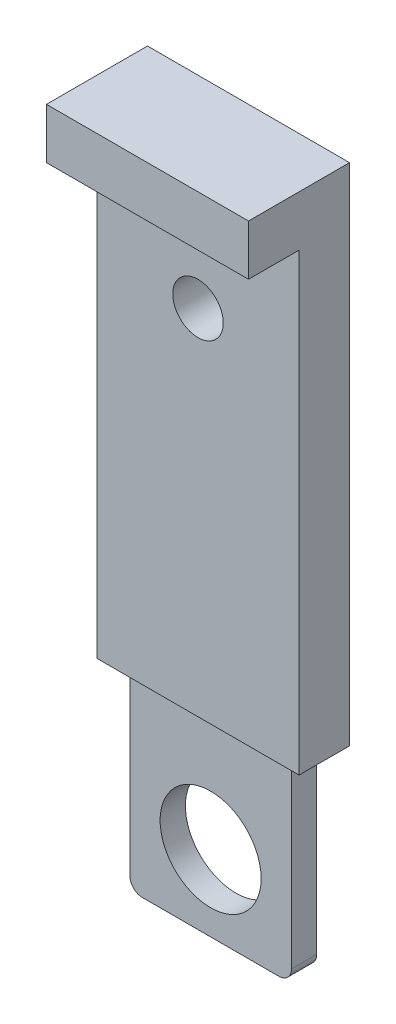
ISO-10303-21;
HEADER;
FILE_DESCRIPTION(('STEP AP214'),'2;1');
FILE_NAME('part.step','',(''),(''),'','','');
FILE_SCHEMA(('AUTOMOTIVE_DESIGN { 1 0 10303 214 1 1 1 1 }'));
ENDSEC;
DATA;
#1=APPLICATION_CONTEXT('core data for automotive mechanical design processes');
#2=APPLICATION_PROTOCOL_DEFINITION('international standard','automotive_design',2000,#1);
#3=PRODUCT_CONTEXT('',#1,'mechanical');
#4=PRODUCT('Part','Part','',(#3));
#5=PRODUCT_RELATED_PRODUCT_CATEGORY('part','',(#4));
#6=PRODUCT_DEFINITION_FORMATION('','',#4);
#7=PRODUCT_DEFINITION_CONTEXT('part definition',#1,'design');
#8=PRODUCT_DEFINITION('design','',#6,#7);
#9=PRODUCT_DEFINITION_SHAPE('','',#8);
#10=(LENGTH_UNIT() NAMED_UNIT(*) SI_UNIT(.MILLI.,.METRE.));
#11=(NAMED_UNIT(*) PLANE_ANGLE_UNIT() SI_UNIT($,.RADIAN.));
#12=(NAMED_UNIT(*) SI_UNIT($,.STERADIAN.) SOLID_ANGLE_UNIT());
#13=UNCERTAINTY_MEASURE_WITH_UNIT(LENGTH_MEASURE(1.E-05),#10,'distance_accuracy_value','');
#14=(GEOMETRIC_REPRESENTATION_CONTEXT(3) GLOBAL_UNCERTAINTY_ASSIGNED_CONTEXT((#13)) GLOBAL_UNIT_ASSIGNED_CONTEXT((#10,
#11,#12)) REPRESENTATION_CONTEXT('',''));
#15=CARTESIAN_POINT('',(0.,0.,0.));
#16=DIRECTION('',(0.,0.,1.));
#17=DIRECTION('',(1.,0.,0.));
#18=AXIS2_PLACEMENT_3D('',#15,#16,#17);
#19=CARTESIAN_POINT('',(0.,0.,0.));
#20=DIRECTION('',(0.,1.,0.));
#21=DIRECTION('',(0.,0.,1.));
#22=AXIS2_PLACEMENT_3D('',#19,#20,#21);
#23=PLANE('',#22);
#24=DIRECTION('',(1.,0.,0.));
#25=VECTOR('',#24,1.);
#26=CARTESIAN_POINT('',(-2.,0.,0.499999999999999));
#27=LINE('',#26,#25);
#28=CARTESIAN_POINT('',(1.85,0.,0.5));
#29=VERTEX_POINT('',#28);
#30=CARTESIAN_POINT('',(2.,0.,0.5));
#31=VERTEX_POINT('',#30);
#32=EDGE_CURVE('E193',#29,#31,#27,.T.);
#33=ORIENTED_EDGE('',*,*,#32,.F.);
#34=DIRECTION('',(0.,0.,1.));
#35=VECTOR('',#34,1.);
#36=CARTESIAN_POINT('',(1.85,0.,-0.25));
#37=LINE('',#36,#35);
#38=CARTESIAN_POINT('',(1.85,0.,-0.500000000000001));
#39=VERTEX_POINT('',#38);
#40=EDGE_CURVE('E219',#29,#39,#37,.F.);
#41=ORIENTED_EDGE('',*,*,#40,.T.);
#42=DIRECTION('',(1.,0.,0.));
#43=VECTOR('',#42,1.);
#44=CARTESIAN_POINT('',(-2.,0.,-0.500000000000002));
#45=LINE('',#44,#43);
#46=CARTESIAN_POINT('',(2.,0.,-0.5));
#47=VERTEX_POINT('',#46);
#48=EDGE_CURVE('E201',#39,#47,#45,.T.);
#49=ORIENTED_EDGE('',*,*,#48,.T.);
#50=DIRECTION('',(0.,0.,1.));
#51=VECTOR('',#50,1.);
#52=CARTESIAN_POINT('',(2.,0.,-0.5));
#53=LINE('',#52,#51);
#54=EDGE_CURVE('E197',#47,#31,#53,.T.);
#55=ORIENTED_EDGE('',*,*,#54,.T.);
#56=EDGE_LOOP('',(#33,#41,#49,#55));
#57=FACE_BOUND('',#56,.T.);
#58=ADVANCED_FACE('F32',(#57),#23,.F.);
#59=CARTESIAN_POINT('',(-2.,0.,-0.500000000000002));
#60=VERTEX_POINT('',#59);
#61=CARTESIAN_POINT('',(-1.85,0.,-0.500000000000002));
#62=VERTEX_POINT('',#61);
#63=EDGE_CURVE('E187',#60,#62,#45,.T.);
#64=ORIENTED_EDGE('',*,*,#63,.T.);
#65=DIRECTION('',(0.,0.,-1.));
#66=VECTOR('',#65,1.);
#67=CARTESIAN_POINT('',(-1.85,0.,0.25));
#68=LINE('',#67,#66);
#69=CARTESIAN_POINT('',(-1.85,0.,0.499999999999999));
#70=VERTEX_POINT('',#69);
#71=EDGE_CURVE('E217',#62,#70,#68,.F.);
#72=ORIENTED_EDGE('',*,*,#71,.T.);
#73=CARTESIAN_POINT('',(-2.,0.,0.499999999999999));
#74=VERTEX_POINT('',#73);
#75=EDGE_CURVE('E194',#74,#70,#27,.T.);
#76=ORIENTED_EDGE('',*,*,#75,.F.);
#77=DIRECTION('',(0.,0.,1.));
#78=VECTOR('',#77,1.);
#79=CARTESIAN_POINT('',(-2.,0.,-0.500000000000002));
#80=LINE('',#79,#78);
#81=EDGE_CURVE('E186',#60,#74,#80,.T.);
#82=ORIENTED_EDGE('',*,*,#81,.F.);
#83=EDGE_LOOP('',(#64,#72,#76,#82));
#84=FACE_BOUND('',#83,.T.);
#85=ADVANCED_FACE('F312',(#84),#23,.F.);
#86=CARTESIAN_POINT('',(-2.,10.,0.499999999999999));
#87=DIRECTION('',(0.,0.,-1.));
#88=DIRECTION('',(-1.,0.,0.));
#89=AXIS2_PLACEMENT_3D('',#86,#87,#88);
#90=PLANE('',#89);
#91=CARTESIAN_POINT('',(0.,7.,0.499999999999999));
#92=DIRECTION('',(0.,0.,-1.));
#93=DIRECTION('',(-1.,0.,0.));
#94=AXIS2_PLACEMENT_3D('',#91,#92,#93);
#95=CIRCLE('',#94,0.5);
#96=CARTESIAN_POINT('',(-0.5,7.,0.499999999999999));
#97=VERTEX_POINT('',#96);
#98=EDGE_CURVE('E183',#97,#97,#95,.T.);
#99=ORIENTED_EDGE('',*,*,#98,.T.);
#100=EDGE_LOOP('',(#99));
#101=FACE_BOUND('',#100,.T.);
#102=DIRECTION('',(1.,0.,0.));
#103=VECTOR('',#102,1.);
#104=CARTESIAN_POINT('',(2.,9.,0.5));
#105=LINE('',#104,#103);
#106=CARTESIAN_POINT('',(-2.,9.,0.499999999999999));
#107=VERTEX_POINT('',#106);
#108=CARTESIAN_POINT('',(2.,9.,0.5));
#109=VERTEX_POINT('',#108);
#110=EDGE_CURVE('E165',#107,#109,#105,.T.);
#111=ORIENTED_EDGE('',*,*,#110,.F.);
#112=DIRECTION('',(0.,-1.,0.));
#113=VECTOR('',#112,1.);
#114=CARTESIAN_POINT('',(-2.,10.,0.499999999999999));
#115=LINE('',#114,#113);
#116=EDGE_CURVE('E210',#107,#74,#115,.T.);
#117=ORIENTED_EDGE('',*,*,#116,.T.);
#118=ORIENTED_EDGE('',*,*,#75,.T.);
#119=EDGE_CURVE('E198',#70,#29,#27,.T.);
#120=ORIENTED_EDGE('',*,*,#119,.T.);
#121=ORIENTED_EDGE('',*,*,#32,.T.);
#122=DIRECTION('',(0.,-1.,0.));
#123=VECTOR('',#122,1.);
#124=CARTESIAN_POINT('',(2.,10.,0.5));
#125=LINE('',#124,#123);
#126=EDGE_CURVE('E207',#109,#31,#125,.T.);
#127=ORIENTED_EDGE('',*,*,#126,.F.);
#128=EDGE_LOOP('',(#111,#117,#118,#120,#121,#127));
#129=FACE_BOUND('',#128,.T.);
#130=ADVANCED_FACE('F318',(#101,#129),#90,.F.);
#131=CARTESIAN_POINT('',(-2.,10.,-0.500000000000002));
#132=DIRECTION('',(1.,0.,0.));
#133=DIRECTION('',(0.,0.,-1.));
#134=AXIS2_PLACEMENT_3D('',#131,#132,#133);
#135=PLANE('',#134);
#136=ORIENTED_EDGE('',*,*,#81,.T.);
#137=ORIENTED_EDGE('',*,*,#116,.F.);
#138=DIRECTION('',(0.,0.,-1.));
#139=VECTOR('',#138,1.);
#140=CARTESIAN_POINT('',(-2.,9.,1.5));
#141=LINE('',#140,#139);
#142=CARTESIAN_POINT('',(-2.,9.,1.5));
#143=VERTEX_POINT('',#142);
#144=EDGE_CURVE('E177',#143,#107,#141,.T.);
#145=ORIENTED_EDGE('',*,*,#144,.F.);
#146=DIRECTION('',(0.,-1.,0.));
#147=VECTOR('',#146,1.);
#148=CARTESIAN_POINT('',(-2.,10.,1.5));
#149=LINE('',#148,#147);
#150=CARTESIAN_POINT('',(-2.,10.,1.5));
#151=VERTEX_POINT('',#150);
#152=EDGE_CURVE('E159',#151,#143,#149,.T.);
#153=ORIENTED_EDGE('',*,*,#152,.F.);
#154=DIRECTION('',(0.,0.,1.));
#155=VECTOR('',#154,1.);
#156=CARTESIAN_POINT('',(-2.,10.,-0.500000000000002));
#157=LINE('',#156,#155);
#158=CARTESIAN_POINT('',(-2.,10.,-0.500000000000002));
#159=VERTEX_POINT('',#158);
#160=EDGE_CURVE('E151',#159,#151,#157,.T.);
#161=ORIENTED_EDGE('',*,*,#160,.F.);
#162=DIRECTION('',(0.,-1.,0.));
#163=VECTOR('',#162,1.);
#164=CARTESIAN_POINT('',(-2.,10.,-0.500000000000002));
#165=LINE('',#164,#163);
#166=EDGE_CURVE('E190',#159,#60,#165,.T.);
#167=ORIENTED_EDGE('',*,*,#166,.T.);
#168=EDGE_LOOP('',(#136,#137,#145,#153,#161,#167));
#169=FACE_BOUND('',#168,.T.);
#170=ADVANCED_FACE('F329',(#169),#135,.F.);
#171=CARTESIAN_POINT('',(2.,10.,-0.5));
#172=DIRECTION('',(1.,0.,0.));
#173=DIRECTION('',(0.,0.,-1.));
#174=AXIS2_PLACEMENT_3D('',#171,#172,#173);
#175=PLANE('',#174);
#176=ORIENTED_EDGE('',*,*,#54,.F.);
#177=DIRECTION('',(0.,-1.,0.));
#178=VECTOR('',#177,1.);
#179=CARTESIAN_POINT('',(2.,10.,-0.5));
#180=LINE('',#179,#178);
#181=CARTESIAN_POINT('',(2.,10.,-0.5));
#182=VERTEX_POINT('',#181);
#183=EDGE_CURVE('E146',#182,#47,#180,.T.);
#184=ORIENTED_EDGE('',*,*,#183,.F.);
#185=DIRECTION('',(0.,0.,1.));
#186=VECTOR('',#185,1.);
#187=CARTESIAN_POINT('',(2.,10.,-0.5));
#188=LINE('',#187,#186);
#189=CARTESIAN_POINT('',(2.,10.,1.5));
#190=VERTEX_POINT('',#189);
#191=EDGE_CURVE('E138',#182,#190,#188,.T.);
#192=ORIENTED_EDGE('',*,*,#191,.T.);
#193=DIRECTION('',(0.,1.,0.));
#194=VECTOR('',#193,1.);
#195=CARTESIAN_POINT('',(2.,10.,1.5));
#196=LINE('',#195,#194);
#197=CARTESIAN_POINT('',(2.,9.,1.5));
#198=VERTEX_POINT('',#197);
#199=EDGE_CURVE('E144',#198,#190,#196,.T.);
#200=ORIENTED_EDGE('',*,*,#199,.F.);
#201=DIRECTION('',(0.,0.,-1.));
#202=VECTOR('',#201,1.);
#203=CARTESIAN_POINT('',(2.,9.,1.5));
#204=LINE('',#203,#202);
#205=EDGE_CURVE('E174',#198,#109,#204,.T.);
#206=ORIENTED_EDGE('',*,*,#205,.T.);
#207=ORIENTED_EDGE('',*,*,#126,.T.);
#208=EDGE_LOOP('',(#176,#184,#192,#200,#206,#207));
#209=FACE_BOUND('',#208,.T.);
#210=ADVANCED_FACE('F141',(#209),#175,.T.);
#211=CARTESIAN_POINT('',(-2.,10.,-0.500000000000002));
#212=DIRECTION('',(0.,0.,-1.));
#213=DIRECTION('',(-1.,0.,0.));
#214=AXIS2_PLACEMENT_3D('',#211,#212,#213);
#215=PLANE('',#214);
#216=CARTESIAN_POINT('',(0.,7.,-0.500000000000001));
#217=DIRECTION('',(0.,0.,-1.));
#218=DIRECTION('',(-1.,0.,0.));
#219=AXIS2_PLACEMENT_3D('',#216,#217,#218);
#220=CIRCLE('',#219,0.5);
#221=CARTESIAN_POINT('',(-0.5,7.,-0.500000000000002));
#222=VERTEX_POINT('',#221);
#223=EDGE_CURVE('E180',#222,#222,#220,.T.);
#224=ORIENTED_EDGE('',*,*,#223,.F.);
#225=EDGE_LOOP('',(#224));
#226=FACE_BOUND('',#225,.T.);
#227=ORIENTED_EDGE('',*,*,#63,.F.);
#228=ORIENTED_EDGE('',*,*,#166,.F.);
#229=DIRECTION('',(1.,0.,0.));
#230=VECTOR('',#229,1.);
#231=CARTESIAN_POINT('',(-2.,10.,-0.500000000000002));
#232=LINE('',#231,#230);
#233=EDGE_CURVE('E150',#159,#182,#232,.T.);
#234=ORIENTED_EDGE('',*,*,#233,.T.);
#235=ORIENTED_EDGE('',*,*,#183,.T.);
#236=ORIENTED_EDGE('',*,*,#48,.F.);
#237=EDGE_CURVE('E204',#62,#39,#45,.T.);
#238=ORIENTED_EDGE('',*,*,#237,.F.);
#239=EDGE_LOOP('',(#227,#228,#234,#235,#236,#238));
#240=FACE_BOUND('',#239,.T.);
#241=ADVANCED_FACE('F323',(#226,#240),#215,.T.);
#242=CARTESIAN_POINT('',(0.,10.,0.));
#243=DIRECTION('',(0.,1.,0.));
#244=DIRECTION('',(0.,0.,1.));
#245=AXIS2_PLACEMENT_3D('',#242,#243,#244);
#246=PLANE('',#245);
#247=ORIENTED_EDGE('',*,*,#160,.T.);
#248=DIRECTION('',(-1.,0.,0.));
#249=VECTOR('',#248,1.);
#250=CARTESIAN_POINT('',(2.,10.,1.5));
#251=LINE('',#250,#249);
#252=EDGE_CURVE('E154',#190,#151,#251,.T.);
#253=ORIENTED_EDGE('',*,*,#252,.F.);
#254=ORIENTED_EDGE('',*,*,#191,.F.);
#255=ORIENTED_EDGE('',*,*,#233,.F.);
#256=EDGE_LOOP('',(#247,#253,#254,#255));
#257=FACE_BOUND('',#256,.T.);
#258=ADVANCED_FACE('F155',(#257),#246,.T.);
#259=CARTESIAN_POINT('',(0.,7.,9.5));
#260=DIRECTION('',(0.,0.,-1.));
#261=DIRECTION('',(-1.,0.,0.));
#262=AXIS2_PLACEMENT_3D('',#259,#260,#261);
#263=CYLINDRICAL_SURFACE('',#262,0.5);
#264=ORIENTED_EDGE('',*,*,#223,.T.);
#265=EDGE_LOOP('',(#264));
#266=FACE_BOUND('',#265,.T.);
#267=ORIENTED_EDGE('',*,*,#98,.F.);
#268=EDGE_LOOP('',(#267));
#269=FACE_BOUND('',#268,.T.);
#270=ADVANCED_FACE('F465',(#266,#269),#263,.F.);
#271=CARTESIAN_POINT('',(2.,9.,1.5));
#272=DIRECTION('',(0.,1.,0.));
#273=DIRECTION('',(0.,0.,1.));
#274=AXIS2_PLACEMENT_3D('',#271,#272,#273);
#275=PLANE('',#274);
#276=ORIENTED_EDGE('',*,*,#110,.T.);
#277=ORIENTED_EDGE('',*,*,#205,.F.);
#278=DIRECTION('',(1.,0.,0.));
#279=VECTOR('',#278,1.);
#280=CARTESIAN_POINT('',(2.,9.,1.5));
#281=LINE('',#280,#279);
#282=EDGE_CURVE('E163',#143,#198,#281,.T.);
#283=ORIENTED_EDGE('',*,*,#282,.F.);
#284=ORIENTED_EDGE('',*,*,#144,.T.);
#285=EDGE_LOOP('',(#276,#277,#283,#284));
#286=FACE_BOUND('',#285,.T.);
#287=ADVANCED_FACE('F309',(#286),#275,.F.);
#288=CARTESIAN_POINT('',(0.,0.,1.5));
#289=DIRECTION('',(0.,0.,-1.));
#290=DIRECTION('',(-1.,0.,0.));
#291=AXIS2_PLACEMENT_3D('',#288,#289,#290);
#292=PLANE('',#291);
#293=ORIENTED_EDGE('',*,*,#199,.T.);
#294=ORIENTED_EDGE('',*,*,#252,.T.);
#295=ORIENTED_EDGE('',*,*,#152,.T.);
#296=ORIENTED_EDGE('',*,*,#282,.T.);
#297=EDGE_LOOP('',(#293,#294,#295,#296));
#298=FACE_BOUND('',#297,.T.);
#299=ADVANCED_FACE('F161',(#298),#292,.F.);
#300=CARTESIAN_POINT('',(-1.6,-3.9,0.25));
#301=DIRECTION('',(1.,0.,0.));
#302=DIRECTION('',(0.,0.,-1.));
#303=AXIS2_PLACEMENT_3D('',#300,#301,#302);
#304=PLANE('',#303);
#305=DIRECTION('',(0.,1.,0.));
#306=VECTOR('',#305,1.);
#307=CARTESIAN_POINT('',(-1.6,-3.9,0.25));
#308=LINE('',#307,#306);
#309=CARTESIAN_POINT('',(-1.6,-3.65,0.25));
#310=VERTEX_POINT('',#309);
#311=CARTESIAN_POINT('',(-1.6,-0.25,0.25));
#312=VERTEX_POINT('',#311);
#313=EDGE_CURVE('E265',#310,#312,#308,.T.);
#314=ORIENTED_EDGE('',*,*,#313,.T.);
#315=DIRECTION('',(0.,0.,-1.));
#316=VECTOR('',#315,1.);
#317=CARTESIAN_POINT('',(-1.6,-0.25,-0.25));
#318=LINE('',#317,#316);
#319=CARTESIAN_POINT('',(-1.6,-0.25,-0.25));
#320=VERTEX_POINT('',#319);
#321=EDGE_CURVE('E230',#312,#320,#318,.T.);
#322=ORIENTED_EDGE('',*,*,#321,.T.);
#323=DIRECTION('',(0.,1.,0.));
#324=VECTOR('',#323,1.);
#325=CARTESIAN_POINT('',(-1.6,-3.9,-0.25));
#326=LINE('',#325,#324);
#327=CARTESIAN_POINT('',(-1.6,-3.65,-0.25));
#328=VERTEX_POINT('',#327);
#329=EDGE_CURVE('E168',#328,#320,#326,.T.);
#330=ORIENTED_EDGE('',*,*,#329,.F.);
#331=DIRECTION('',(0.,0.,-1.));
#332=VECTOR('',#331,1.);
#333=CARTESIAN_POINT('',(-1.6,-3.65,0.25));
#334=LINE('',#333,#332);
#335=EDGE_CURVE('E228',#328,#310,#334,.F.);
#336=ORIENTED_EDGE('',*,*,#335,.T.);
#337=EDGE_LOOP('',(#314,#322,#330,#336));
#338=FACE_BOUND('',#337,.T.);
#339=ADVANCED_FACE('F300',(#338),#304,.F.);
#340=CARTESIAN_POINT('',(1.6,-3.9,-0.25));
#341=DIRECTION('',(0.,0.,1.));
#342=DIRECTION('',(1.,0.,0.));
#343=AXIS2_PLACEMENT_3D('',#340,#341,#342);
#344=PLANE('',#343);
#345=CARTESIAN_POINT('',(0.,-2.4,-0.25));
#346=DIRECTION('',(0.,0.,1.));
#347=DIRECTION('',(1.,0.,0.));
#348=AXIS2_PLACEMENT_3D('',#345,#346,#347);
#349=CIRCLE('',#348,1.);
#350=CARTESIAN_POINT('',(1.,-2.4,-0.25));
#351=VERTEX_POINT('',#350);
#352=EDGE_CURVE('E253',#351,#351,#349,.T.);
#353=ORIENTED_EDGE('',*,*,#352,.T.);
#354=EDGE_LOOP('',(#353));
#355=FACE_BOUND('',#354,.T.);
#356=ORIENTED_EDGE('',*,*,#329,.T.);
#357=DIRECTION('',(1.,0.,0.));
#358=VECTOR('',#357,1.);
#359=CARTESIAN_POINT('',(1.6,-0.25,-0.25));
#360=LINE('',#359,#358);
#361=CARTESIAN_POINT('',(1.6,-0.25,-0.25));
#362=VERTEX_POINT('',#361);
#363=EDGE_CURVE('E226',#320,#362,#360,.T.);
#364=ORIENTED_EDGE('',*,*,#363,.T.);
#365=DIRECTION('',(0.,1.,0.));
#366=VECTOR('',#365,1.);
#367=CARTESIAN_POINT('',(1.6,-3.9,-0.25));
#368=LINE('',#367,#366);
#369=CARTESIAN_POINT('',(1.6,-3.65,-0.25));
#370=VERTEX_POINT('',#369);
#371=EDGE_CURVE('E270',#370,#362,#368,.T.);
#372=ORIENTED_EDGE('',*,*,#371,.F.);
#373=CARTESIAN_POINT('',(1.35,-3.65,-0.25));
#374=DIRECTION('',(0.,0.,1.));
#375=DIRECTION('',(1.,0.,0.));
#376=AXIS2_PLACEMENT_3D('',#373,#374,#375);
#377=CIRCLE('',#376,0.25);
#378=CARTESIAN_POINT('',(1.35,-3.9,-0.25));
#379=VERTEX_POINT('',#378);
#380=EDGE_CURVE('E222',#370,#379,#377,.F.);
#381=ORIENTED_EDGE('',*,*,#380,.T.);
#382=DIRECTION('',(1.,0.,0.));
#383=VECTOR('',#382,1.);
#384=CARTESIAN_POINT('',(1.6,-3.9,-0.25));
#385=LINE('',#384,#383);
#386=CARTESIAN_POINT('',(-1.35,-3.9,-0.25));
#387=VERTEX_POINT('',#386);
#388=EDGE_CURVE('E258',#387,#379,#385,.T.);
#389=ORIENTED_EDGE('',*,*,#388,.F.);
#390=CARTESIAN_POINT('',(-1.35,-3.65,-0.25));
#391=DIRECTION('',(0.,0.,1.));
#392=DIRECTION('',(1.,0.,0.));
#393=AXIS2_PLACEMENT_3D('',#390,#391,#392);
#394=CIRCLE('',#393,0.25);
#395=EDGE_CURVE('E224',#387,#328,#394,.F.);
#396=ORIENTED_EDGE('',*,*,#395,.T.);
#397=EDGE_LOOP('',(#356,#364,#372,#381,#389,#396));
#398=FACE_BOUND('',#397,.T.);
#399=ADVANCED_FACE('F278',(#355,#398),#344,.F.);
#400=CARTESIAN_POINT('',(1.6,-3.9,0.25));
#401=DIRECTION('',(-1.,0.,0.));
#402=DIRECTION('',(0.,0.,1.));
#403=AXIS2_PLACEMENT_3D('',#400,#401,#402);
#404=PLANE('',#403);
#405=ORIENTED_EDGE('',*,*,#371,.T.);
#406=DIRECTION('',(0.,0.,1.));
#407=VECTOR('',#406,1.);
#408=CARTESIAN_POINT('',(1.6,-0.25,0.25));
#409=LINE('',#408,#407);
#410=CARTESIAN_POINT('',(1.6,-0.25,0.25));
#411=VERTEX_POINT('',#410);
#412=EDGE_CURVE('E214',#362,#411,#409,.T.);
#413=ORIENTED_EDGE('',*,*,#412,.T.);
#414=DIRECTION('',(0.,1.,0.));
#415=VECTOR('',#414,1.);
#416=CARTESIAN_POINT('',(1.6,-3.9,0.25));
#417=LINE('',#416,#415);
#418=CARTESIAN_POINT('',(1.6,-3.65,0.25));
#419=VERTEX_POINT('',#418);
#420=EDGE_CURVE('E268',#419,#411,#417,.T.);
#421=ORIENTED_EDGE('',*,*,#420,.F.);
#422=DIRECTION('',(0.,0.,1.));
#423=VECTOR('',#422,1.);
#424=CARTESIAN_POINT('',(1.6,-3.65,0.25));
#425=LINE('',#424,#423);
#426=EDGE_CURVE('E212',#419,#370,#425,.F.);
#427=ORIENTED_EDGE('',*,*,#426,.T.);
#428=EDGE_LOOP('',(#405,#413,#421,#427));
#429=FACE_BOUND('',#428,.T.);
#430=ADVANCED_FACE('F293',(#429),#404,.F.);
#431=CARTESIAN_POINT('',(1.6,-3.9,0.25));
#432=DIRECTION('',(0.,0.,-1.));
#433=DIRECTION('',(-1.,0.,0.));
#434=AXIS2_PLACEMENT_3D('',#431,#432,#433);
#435=PLANE('',#434);
#436=CARTESIAN_POINT('',(0.,-2.4,0.25));
#437=DIRECTION('',(0.,0.,1.));
#438=DIRECTION('',(1.,0.,0.));
#439=AXIS2_PLACEMENT_3D('',#436,#437,#438);
#440=CIRCLE('',#439,1.);
#441=CARTESIAN_POINT('',(1.,-2.4,0.25));
#442=VERTEX_POINT('',#441);
#443=EDGE_CURVE('E247',#442,#442,#440,.T.);
#444=ORIENTED_EDGE('',*,*,#443,.F.);
#445=EDGE_LOOP('',(#444));
#446=FACE_BOUND('',#445,.T.);
#447=ORIENTED_EDGE('',*,*,#420,.T.);
#448=DIRECTION('',(-1.,0.,0.));
#449=VECTOR('',#448,1.);
#450=CARTESIAN_POINT('',(-1.6,-0.25,0.25));
#451=LINE('',#450,#449);
#452=EDGE_CURVE('E234',#411,#312,#451,.T.);
#453=ORIENTED_EDGE('',*,*,#452,.T.);
#454=ORIENTED_EDGE('',*,*,#313,.F.);
#455=CARTESIAN_POINT('',(-1.35,-3.65,0.25));
#456=DIRECTION('',(0.,0.,-1.));
#457=DIRECTION('',(-1.,0.,0.));
#458=AXIS2_PLACEMENT_3D('',#455,#456,#457);
#459=CIRCLE('',#458,0.25);
#460=CARTESIAN_POINT('',(-1.35,-3.9,0.25));
#461=VERTEX_POINT('',#460);
#462=EDGE_CURVE('E49',#310,#461,#459,.F.);
#463=ORIENTED_EDGE('',*,*,#462,.T.);
#464=DIRECTION('',(-1.,0.,0.));
#465=VECTOR('',#464,1.);
#466=CARTESIAN_POINT('',(1.6,-3.9,0.25));
#467=LINE('',#466,#465);
#468=CARTESIAN_POINT('',(1.35,-3.9,0.25));
#469=VERTEX_POINT('',#468);
#470=EDGE_CURVE('E263',#469,#461,#467,.T.);
#471=ORIENTED_EDGE('',*,*,#470,.F.);
#472=CARTESIAN_POINT('',(1.35,-3.65,0.25));
#473=DIRECTION('',(0.,0.,-1.));
#474=DIRECTION('',(-1.,0.,0.));
#475=AXIS2_PLACEMENT_3D('',#472,#473,#474);
#476=CIRCLE('',#475,0.25);
#477=EDGE_CURVE('E57',#469,#419,#476,.F.);
#478=ORIENTED_EDGE('',*,*,#477,.T.);
#479=EDGE_LOOP('',(#447,#453,#454,#463,#471,#478));
#480=FACE_BOUND('',#479,.T.);
#481=ADVANCED_FACE('F294',(#446,#480),#435,.F.);
#482=CARTESIAN_POINT('',(0.,-3.9,0.));
#483=DIRECTION('',(0.,1.,0.));
#484=DIRECTION('',(0.,0.,1.));
#485=AXIS2_PLACEMENT_3D('',#482,#483,#484);
#486=PLANE('',#485);
#487=ORIENTED_EDGE('',*,*,#470,.T.);
#488=DIRECTION('',(0.,0.,-1.));
#489=VECTOR('',#488,1.);
#490=CARTESIAN_POINT('',(-1.35,-3.9,0.));
#491=LINE('',#490,#489);
#492=EDGE_CURVE('E11',#461,#387,#491,.T.);
#493=ORIENTED_EDGE('',*,*,#492,.T.);
#494=ORIENTED_EDGE('',*,*,#388,.T.);
#495=DIRECTION('',(0.,0.,1.));
#496=VECTOR('',#495,1.);
#497=CARTESIAN_POINT('',(1.35,-3.9,0.));
#498=LINE('',#497,#496);
#499=EDGE_CURVE('E41',#379,#469,#498,.T.);
#500=ORIENTED_EDGE('',*,*,#499,.T.);
#501=EDGE_LOOP('',(#487,#493,#494,#500));
#502=FACE_BOUND('',#501,.T.);
#503=ADVANCED_FACE('F297',(#502),#486,.F.);
#504=CARTESIAN_POINT('',(0.,-2.4,-3.65));
#505=DIRECTION('',(0.,0.,1.));
#506=DIRECTION('',(1.,0.,0.));
#507=AXIS2_PLACEMENT_3D('',#504,#505,#506);
#508=CYLINDRICAL_SURFACE('',#507,1.);
#509=ORIENTED_EDGE('',*,*,#443,.T.);
#510=EDGE_LOOP('',(#509));
#511=FACE_BOUND('',#510,.T.);
#512=ORIENTED_EDGE('',*,*,#352,.F.);
#513=EDGE_LOOP('',(#512));
#514=FACE_BOUND('',#513,.T.);
#515=ADVANCED_FACE('F344',(#511,#514),#508,.F.);
#516=CARTESIAN_POINT('',(-1.85,-0.25,0.25));
#517=DIRECTION('',(0.,0.,1.));
#518=DIRECTION('',(1.,0.,0.));
#519=AXIS2_PLACEMENT_3D('',#516,#517,#518);
#520=CYLINDRICAL_SURFACE('',#519,0.25);
#521=CARTESIAN_POINT('',(-1.85,-0.25,0.5));
#522=DIRECTION('',(0.707106781186547,0.,0.707106781186547));
#523=DIRECTION('',(0.707106781186547,0.,-0.707106781186547));
#524=AXIS2_PLACEMENT_3D('',#521,#522,#523);
#525=ELLIPSE('',#524,0.353553390593274,0.25);
#526=EDGE_CURVE('E240',#70,#312,#525,.F.);
#527=ORIENTED_EDGE('',*,*,#526,.F.);
#528=ORIENTED_EDGE('',*,*,#71,.F.);
#529=CARTESIAN_POINT('',(-1.85,-0.25,-0.5));
#530=DIRECTION('',(-0.707106781186547,0.,0.707106781186547));
#531=DIRECTION('',(0.707106781186547,0.,0.707106781186547));
#532=AXIS2_PLACEMENT_3D('',#529,#530,#531);
#533=ELLIPSE('',#532,0.353553390593274,0.25);
#534=EDGE_CURVE('E36',#320,#62,#533,.T.);
#535=ORIENTED_EDGE('',*,*,#534,.F.);
#536=ORIENTED_EDGE('',*,*,#321,.F.);
#537=EDGE_LOOP('',(#527,#528,#535,#536));
#538=FACE_BOUND('',#537,.T.);
#539=ADVANCED_FACE('F285',(#538),#520,.F.);
#540=CARTESIAN_POINT('',(1.6,-0.25,-0.5));
#541=DIRECTION('',(-1.,0.,0.));
#542=DIRECTION('',(0.,0.,1.));
#543=AXIS2_PLACEMENT_3D('',#540,#541,#542);
#544=CYLINDRICAL_SURFACE('',#543,0.25);
#545=ORIENTED_EDGE('',*,*,#534,.T.);
#546=ORIENTED_EDGE('',*,*,#237,.T.);
#547=CARTESIAN_POINT('',(1.85,-0.25,-0.5));
#548=DIRECTION('',(-0.707106781186547,0.,-0.707106781186547));
#549=DIRECTION('',(-0.707106781186547,0.,0.707106781186547));
#550=AXIS2_PLACEMENT_3D('',#547,#548,#549);
#551=ELLIPSE('',#550,0.353553390593274,0.25);
#552=EDGE_CURVE('E239',#362,#39,#551,.T.);
#553=ORIENTED_EDGE('',*,*,#552,.F.);
#554=ORIENTED_EDGE('',*,*,#363,.F.);
#555=EDGE_LOOP('',(#545,#546,#553,#554));
#556=FACE_BOUND('',#555,.T.);
#557=ADVANCED_FACE('F286',(#556),#544,.F.);
#558=CARTESIAN_POINT('',(1.6,-0.25,0.5));
#559=DIRECTION('',(1.,0.,0.));
#560=DIRECTION('',(0.,0.,-1.));
#561=AXIS2_PLACEMENT_3D('',#558,#559,#560);
#562=CYLINDRICAL_SURFACE('',#561,0.25);
#563=ORIENTED_EDGE('',*,*,#526,.T.);
#564=ORIENTED_EDGE('',*,*,#452,.F.);
#565=CARTESIAN_POINT('',(1.85,-0.25,0.5));
#566=DIRECTION('',(0.707106781186547,0.,-0.707106781186547));
#567=DIRECTION('',(0.707106781186547,0.,0.707106781186547));
#568=AXIS2_PLACEMENT_3D('',#565,#566,#567);
#569=ELLIPSE('',#568,0.353553390593274,0.25);
#570=EDGE_CURVE('E237',#29,#411,#569,.F.);
#571=ORIENTED_EDGE('',*,*,#570,.F.);
#572=ORIENTED_EDGE('',*,*,#119,.F.);
#573=EDGE_LOOP('',(#563,#564,#571,#572));
#574=FACE_BOUND('',#573,.T.);
#575=ADVANCED_FACE('F338',(#574),#562,.F.);
#576=CARTESIAN_POINT('',(1.85,-0.25,0.25));
#577=DIRECTION('',(0.,0.,-1.));
#578=DIRECTION('',(-1.,0.,0.));
#579=AXIS2_PLACEMENT_3D('',#576,#577,#578);
#580=CYLINDRICAL_SURFACE('',#579,0.25);
#581=ORIENTED_EDGE('',*,*,#552,.T.);
#582=ORIENTED_EDGE('',*,*,#40,.F.);
#583=ORIENTED_EDGE('',*,*,#570,.T.);
#584=ORIENTED_EDGE('',*,*,#412,.F.);
#585=EDGE_LOOP('',(#581,#582,#583,#584));
#586=FACE_BOUND('',#585,.T.);
#587=ADVANCED_FACE('F290',(#586),#580,.F.);
#588=CARTESIAN_POINT('',(-1.35,-3.65,0.));
#589=DIRECTION('',(0.,0.,-1.));
#590=DIRECTION('',(-1.,0.,0.));
#591=AXIS2_PLACEMENT_3D('',#588,#589,#590);
#592=CYLINDRICAL_SURFACE('',#591,0.25);
#593=ORIENTED_EDGE('',*,*,#462,.F.);
#594=ORIENTED_EDGE('',*,*,#335,.F.);
#595=ORIENTED_EDGE('',*,*,#395,.F.);
#596=ORIENTED_EDGE('',*,*,#492,.F.);
#597=EDGE_LOOP('',(#593,#594,#595,#596));
#598=FACE_BOUND('',#597,.T.);
#599=ADVANCED_FACE('F299',(#598),#592,.T.);
#600=CARTESIAN_POINT('',(1.35,-3.65,0.));
#601=DIRECTION('',(0.,0.,1.));
#602=DIRECTION('',(1.,0.,0.));
#603=AXIS2_PLACEMENT_3D('',#600,#601,#602);
#604=CYLINDRICAL_SURFACE('',#603,0.25);
#605=ORIENTED_EDGE('',*,*,#380,.F.);
#606=ORIENTED_EDGE('',*,*,#426,.F.);
#607=ORIENTED_EDGE('',*,*,#477,.F.);
#608=ORIENTED_EDGE('',*,*,#499,.F.);
#609=EDGE_LOOP('',(#605,#606,#607,#608));
#610=FACE_BOUND('',#609,.T.);
#611=ADVANCED_FACE('F34',(#610),#604,.T.);
#612=CLOSED_SHELL('',(#58,#85,#130,#170,#210,#241,#258,#270,#287,#299,#339,#399,#430,#481,#503,
#515,#539,#557,#575,#587,#599,#611));
#613=MANIFOLD_SOLID_BREP('B2',#612);
#614=ADVANCED_BREP_SHAPE_REPRESENTATION('',(#18,#613),#14);
#615=SHAPE_DEFINITION_REPRESENTATION(#9,#614);
ENDSEC;
END-ISO-10303-21;
